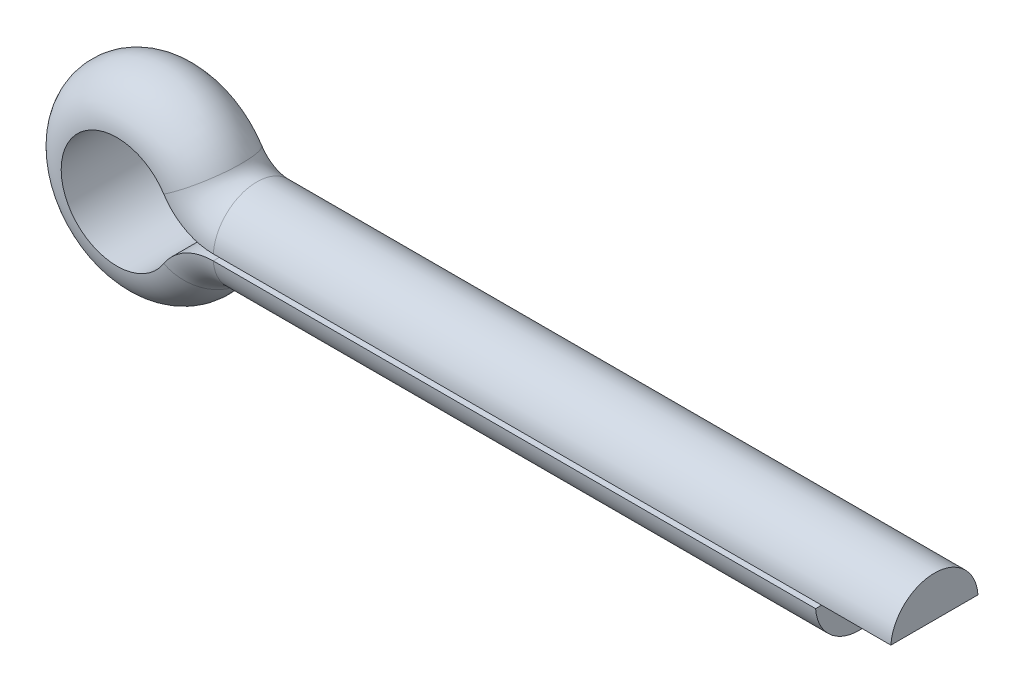
ISO-10303-21;
HEADER;
FILE_DESCRIPTION(('STEP AP214'),'2;1');
FILE_NAME('part.step','',(''),(''),'','','');
FILE_SCHEMA(('AUTOMOTIVE_DESIGN { 1 0 10303 214 1 1 1 1 }'));
ENDSEC;
DATA;
#1=APPLICATION_CONTEXT('core data for automotive mechanical design processes');
#2=APPLICATION_PROTOCOL_DEFINITION('international standard','automotive_design',2000,#1);
#3=PRODUCT_CONTEXT('',#1,'mechanical');
#4=PRODUCT('Part','Part','',(#3));
#5=PRODUCT_RELATED_PRODUCT_CATEGORY('part','',(#4));
#6=PRODUCT_DEFINITION_FORMATION('','',#4);
#7=PRODUCT_DEFINITION_CONTEXT('part definition',#1,'design');
#8=PRODUCT_DEFINITION('design','',#6,#7);
#9=PRODUCT_DEFINITION_SHAPE('','',#8);
#10=(LENGTH_UNIT() NAMED_UNIT(*) SI_UNIT(.MILLI.,.METRE.));
#11=(NAMED_UNIT(*) PLANE_ANGLE_UNIT() SI_UNIT($,.RADIAN.));
#12=(NAMED_UNIT(*) SI_UNIT($,.STERADIAN.) SOLID_ANGLE_UNIT());
#13=UNCERTAINTY_MEASURE_WITH_UNIT(LENGTH_MEASURE(1.E-05),#10,'distance_accuracy_value','');
#14=(GEOMETRIC_REPRESENTATION_CONTEXT(3) GLOBAL_UNCERTAINTY_ASSIGNED_CONTEXT((#13)) GLOBAL_UNIT_ASSIGNED_CONTEXT((#10,
#11,#12)) REPRESENTATION_CONTEXT('',''));
#15=CARTESIAN_POINT('',(0.,0.,0.));
#16=DIRECTION('',(0.,0.,1.));
#17=DIRECTION('',(1.,0.,0.));
#18=AXIS2_PLACEMENT_3D('',#15,#16,#17);
#19=CARTESIAN_POINT('',(0.,0.,0.));
#20=DIRECTION('',(-1.,0.,0.));
#21=DIRECTION('',(0.,0.,1.));
#22=AXIS2_PLACEMENT_3D('',#19,#20,#21);
#23=PLANE('',#22);
#24=CARTESIAN_POINT('',(0.,0.,0.));
#25=DIRECTION('',(1.,0.,0.));
#26=DIRECTION('',(0.,0.,1.));
#27=AXIS2_PLACEMENT_3D('',#24,#25,#26);
#28=CIRCLE('',#27,1.45);
#29=CARTESIAN_POINT('',(0.,0.1,-1.44654761414894));
#30=VERTEX_POINT('',#29);
#31=CARTESIAN_POINT('',(0.,0.1,1.44654761414894));
#32=VERTEX_POINT('',#31);
#33=EDGE_CURVE('E85',#30,#32,#28,.T.);
#34=ORIENTED_EDGE('',*,*,#33,.T.);
#35=DIRECTION('',(0.,0.,-1.));
#36=VECTOR('',#35,1.);
#37=CARTESIAN_POINT('',(0.,0.1,1.44654761414894));
#38=LINE('',#37,#36);
#39=EDGE_CURVE('E94',#32,#30,#38,.T.);
#40=ORIENTED_EDGE('',*,*,#39,.T.);
#41=EDGE_LOOP('',(#34,#40));
#42=FACE_BOUND('',#41,.T.);
#43=ADVANCED_FACE('F34',(#42),#23,.F.);
#44=CARTESIAN_POINT('',(-2.5,0.,0.));
#45=DIRECTION('',(1.,0.,0.));
#46=DIRECTION('',(0.,0.,1.));
#47=AXIS2_PLACEMENT_3D('',#44,#45,#46);
#48=PLANE('',#47);
#49=CARTESIAN_POINT('',(-2.5,0.,0.));
#50=DIRECTION('',(-1.,0.,0.));
#51=DIRECTION('',(0.,0.,1.));
#52=AXIS2_PLACEMENT_3D('',#49,#50,#51);
#53=CIRCLE('',#52,1.45);
#54=CARTESIAN_POINT('',(-2.5,-0.100000000000002,-1.44654761414894));
#55=VERTEX_POINT('',#54);
#56=CARTESIAN_POINT('',(-2.5,-0.100000000000002,1.44654761414894));
#57=VERTEX_POINT('',#56);
#58=EDGE_CURVE('E48',#55,#57,#53,.T.);
#59=ORIENTED_EDGE('',*,*,#58,.F.);
#60=DIRECTION('',(0.,0.,-1.));
#61=VECTOR('',#60,1.);
#62=CARTESIAN_POINT('',(-2.5,-0.100000000000002,1.44654761414894));
#63=LINE('',#62,#61);
#64=EDGE_CURVE('E11',#57,#55,#63,.T.);
#65=ORIENTED_EDGE('',*,*,#64,.F.);
#66=EDGE_LOOP('',(#59,#65));
#67=FACE_BOUND('',#66,.T.);
#68=ADVANCED_FACE('F185',(#67),#48,.T.);
#69=CARTESIAN_POINT('',(0.,0.,0.));
#70=DIRECTION('',(-1.,0.,0.));
#71=DIRECTION('',(0.,-1.,0.));
#72=AXIS2_PLACEMENT_3D('',#69,#70,#71);
#73=CYLINDRICAL_SURFACE('',#72,1.45);
#74=DIRECTION('',(-1.,0.,0.));
#75=VECTOR('',#74,1.);
#76=CARTESIAN_POINT('',(0.,0.1,1.44654761414894));
#77=LINE('',#76,#75);
#78=CARTESIAN_POINT('',(-22.5,0.0999999999999963,1.44654761414894));
#79=VERTEX_POINT('',#78);
#80=EDGE_CURVE('E92',#32,#79,#77,.T.);
#81=ORIENTED_EDGE('',*,*,#80,.F.);
#82=ORIENTED_EDGE('',*,*,#33,.F.);
#83=DIRECTION('',(-1.,0.,0.));
#84=VECTOR('',#83,1.);
#85=CARTESIAN_POINT('',(0.,0.1,-1.44654761414894));
#86=LINE('',#85,#84);
#87=CARTESIAN_POINT('',(-22.5,0.0999999999999963,-1.44654761414894));
#88=VERTEX_POINT('',#87);
#89=EDGE_CURVE('E90',#30,#88,#86,.T.);
#90=ORIENTED_EDGE('',*,*,#89,.T.);
#91=CARTESIAN_POINT('',(-22.5,0.,0.));
#92=DIRECTION('',(1.,0.,0.));
#93=DIRECTION('',(0.,0.,1.));
#94=AXIS2_PLACEMENT_3D('',#91,#92,#93);
#95=CIRCLE('',#94,1.45);
#96=EDGE_CURVE('E103',#88,#79,#95,.T.);
#97=ORIENTED_EDGE('',*,*,#96,.T.);
#98=EDGE_LOOP('',(#81,#82,#90,#97));
#99=FACE_BOUND('',#98,.T.);
#100=ADVANCED_FACE('F87',(#99),#73,.T.);
#101=CARTESIAN_POINT('',(0.,0.1,1.44654761414894));
#102=DIRECTION('',(0.,1.,0.));
#103=DIRECTION('',(-1.,0.,0.));
#104=AXIS2_PLACEMENT_3D('',#101,#102,#103);
#105=PLANE('',#104);
#106=DIRECTION('',(0.,0.,-1.));
#107=VECTOR('',#106,1.);
#108=CARTESIAN_POINT('',(-22.5,0.0999999999999963,1.44654761414894));
#109=LINE('',#108,#107);
#110=EDGE_CURVE('E101',#79,#88,#109,.T.);
#111=ORIENTED_EDGE('',*,*,#110,.T.);
#112=ORIENTED_EDGE('',*,*,#89,.F.);
#113=ORIENTED_EDGE('',*,*,#39,.F.);
#114=ORIENTED_EDGE('',*,*,#80,.T.);
#115=EDGE_LOOP('',(#111,#112,#113,#114));
#116=FACE_BOUND('',#115,.T.);
#117=ADVANCED_FACE('F99',(#116),#105,.F.);
#118=CARTESIAN_POINT('',(-22.5,2.05071428571442,0.));
#119=DIRECTION('',(0.,0.,-1.));
#120=DIRECTION('',(-1.,0.,0.));
#121=AXIS2_PLACEMENT_3D('',#118,#119,#120);
#122=TOROIDAL_SURFACE('',#121,2.05071428571442,1.45);
#123=CARTESIAN_POINT('',(-22.5,2.05071428571442,1.44654761414894));
#124=DIRECTION('',(0.,0.,-1.));
#125=DIRECTION('',(0.,-1.,0.));
#126=AXIS2_PLACEMENT_3D('',#123,#124,#125);
#127=CIRCLE('',#126,1.95071428571442);
#128=CARTESIAN_POINT('',(-24.1423980454803,0.998186431122002,1.44654761414894));
#129=VERTEX_POINT('',#128);
#130=EDGE_CURVE('E111',#79,#129,#127,.T.);
#131=ORIENTED_EDGE('',*,*,#130,.F.);
#132=ORIENTED_EDGE('',*,*,#96,.F.);
#133=CARTESIAN_POINT('',(-22.5,2.05071428571442,-1.44654761414894));
#134=DIRECTION('',(0.,0.,-1.));
#135=DIRECTION('',(0.,-1.,0.));
#136=AXIS2_PLACEMENT_3D('',#133,#134,#135);
#137=CIRCLE('',#136,1.95071428571442);
#138=CARTESIAN_POINT('',(-24.1423980454803,0.998186431122002,-1.44654761414894));
#139=VERTEX_POINT('',#138);
#140=EDGE_CURVE('E112',#88,#139,#137,.T.);
#141=ORIENTED_EDGE('',*,*,#140,.T.);
#142=CARTESIAN_POINT('',(-24.2265927457246,0.94423040781811,0.));
#143=DIRECTION('',(0.539560233038916,-0.841947002443141,0.));
#144=DIRECTION('',(0.,0.,1.));
#145=AXIS2_PLACEMENT_3D('',#142,#143,#144);
#146=CIRCLE('',#145,1.45);
#147=EDGE_CURVE('E108',#139,#129,#146,.T.);
#148=ORIENTED_EDGE('',*,*,#147,.T.);
#149=EDGE_LOOP('',(#131,#132,#141,#148));
#150=FACE_BOUND('',#149,.T.);
#151=ADVANCED_FACE('F165',(#150),#122,.T.);
#152=CARTESIAN_POINT('',(-22.5,2.05071428571442,0.));
#153=DIRECTION('',(0.,0.,-1.));
#154=DIRECTION('',(-1.,0.,0.));
#155=AXIS2_PLACEMENT_3D('',#152,#153,#154);
#156=CYLINDRICAL_SURFACE('',#155,1.95071428571442);
#157=DIRECTION('',(0.,0.,-1.));
#158=VECTOR('',#157,1.);
#159=CARTESIAN_POINT('',(-24.1423980454803,0.998186431122002,1.44654761414894));
#160=LINE('',#159,#158);
#161=EDGE_CURVE('E115',#129,#139,#160,.T.);
#162=ORIENTED_EDGE('',*,*,#161,.T.);
#163=ORIENTED_EDGE('',*,*,#140,.F.);
#164=ORIENTED_EDGE('',*,*,#110,.F.);
#165=ORIENTED_EDGE('',*,*,#130,.T.);
#166=EDGE_LOOP('',(#162,#163,#164,#165));
#167=FACE_BOUND('',#166,.T.);
#168=ADVANCED_FACE('F163',(#167),#156,.T.);
#169=CARTESIAN_POINT('',(-25.7000000000001,0.,0.));
#170=DIRECTION('',(0.,0.,1.));
#171=DIRECTION('',(1.,0.,0.));
#172=AXIS2_PLACEMENT_3D('',#169,#170,#171);
#173=TOROIDAL_SURFACE('',#172,1.75,1.45);
#174=CARTESIAN_POINT('',(-25.7000000000001,0.,1.44654761414894));
#175=DIRECTION('',(0.,0.,1.));
#176=DIRECTION('',(0.84194700244314,0.539560233038918,0.));
#177=AXIS2_PLACEMENT_3D('',#174,#175,#176);
#178=CIRCLE('',#177,1.85);
#179=CARTESIAN_POINT('',(-24.1423980454803,-0.998186431121999,1.44654761414894));
#180=VERTEX_POINT('',#179);
#181=EDGE_CURVE('E121',#129,#180,#178,.T.);
#182=ORIENTED_EDGE('',*,*,#181,.F.);
#183=ORIENTED_EDGE('',*,*,#147,.F.);
#184=CARTESIAN_POINT('',(-25.7000000000001,0.,-1.44654761414894));
#185=DIRECTION('',(0.,0.,1.));
#186=DIRECTION('',(0.84194700244314,0.539560233038918,0.));
#187=AXIS2_PLACEMENT_3D('',#184,#185,#186);
#188=CIRCLE('',#187,1.85);
#189=CARTESIAN_POINT('',(-24.1423980454803,-0.998186431121999,-1.44654761414894));
#190=VERTEX_POINT('',#189);
#191=EDGE_CURVE('E122',#139,#190,#188,.T.);
#192=ORIENTED_EDGE('',*,*,#191,.T.);
#193=CARTESIAN_POINT('',(-24.2265927457246,-0.944230407818108,0.));
#194=DIRECTION('',(-0.539560233038918,-0.84194700244314,0.));
#195=DIRECTION('',(0.,0.,1.));
#196=AXIS2_PLACEMENT_3D('',#193,#194,#195);
#197=CIRCLE('',#196,1.45);
#198=EDGE_CURVE('E118',#190,#180,#197,.T.);
#199=ORIENTED_EDGE('',*,*,#198,.T.);
#200=EDGE_LOOP('',(#182,#183,#192,#199));
#201=FACE_BOUND('',#200,.T.);
#202=ADVANCED_FACE('F158',(#201),#173,.T.);
#203=CARTESIAN_POINT('',(-25.7000000000001,0.,0.));
#204=DIRECTION('',(0.,0.,1.));
#205=DIRECTION('',(1.,0.,0.));
#206=AXIS2_PLACEMENT_3D('',#203,#204,#205);
#207=CYLINDRICAL_SURFACE('',#206,1.85);
#208=DIRECTION('',(0.,0.,-1.));
#209=VECTOR('',#208,1.);
#210=CARTESIAN_POINT('',(-24.1423980454803,-0.998186431121999,1.44654761414894));
#211=LINE('',#210,#209);
#212=EDGE_CURVE('E125',#180,#190,#211,.T.);
#213=ORIENTED_EDGE('',*,*,#212,.T.);
#214=ORIENTED_EDGE('',*,*,#191,.F.);
#215=ORIENTED_EDGE('',*,*,#161,.F.);
#216=ORIENTED_EDGE('',*,*,#181,.T.);
#217=EDGE_LOOP('',(#213,#214,#215,#216));
#218=FACE_BOUND('',#217,.T.);
#219=ADVANCED_FACE('F161',(#218),#207,.F.);
#220=CARTESIAN_POINT('',(-22.5,-2.05071428571442,0.));
#221=DIRECTION('',(0.,0.,-1.));
#222=DIRECTION('',(-1.,0.,0.));
#223=AXIS2_PLACEMENT_3D('',#220,#221,#222);
#224=TOROIDAL_SURFACE('',#223,2.05071428571442,1.45);
#225=CARTESIAN_POINT('',(-22.5,-2.05071428571442,1.44654761414894));
#226=DIRECTION('',(0.,0.,-1.));
#227=DIRECTION('',(-0.841947002443141,0.539560233038917,0.));
#228=AXIS2_PLACEMENT_3D('',#225,#226,#227);
#229=CIRCLE('',#228,1.95071428571442);
#230=CARTESIAN_POINT('',(-22.5,-0.0999999999999992,1.44654761414894));
#231=VERTEX_POINT('',#230);
#232=EDGE_CURVE('E131',#180,#231,#229,.T.);
#233=ORIENTED_EDGE('',*,*,#232,.F.);
#234=ORIENTED_EDGE('',*,*,#198,.F.);
#235=CARTESIAN_POINT('',(-22.5,-2.05071428571442,-1.44654761414894));
#236=DIRECTION('',(0.,0.,-1.));
#237=DIRECTION('',(-0.841947002443141,0.539560233038917,0.));
#238=AXIS2_PLACEMENT_3D('',#235,#236,#237);
#239=CIRCLE('',#238,1.95071428571442);
#240=CARTESIAN_POINT('',(-22.5,-0.0999999999999992,-1.44654761414894));
#241=VERTEX_POINT('',#240);
#242=EDGE_CURVE('E132',#190,#241,#239,.T.);
#243=ORIENTED_EDGE('',*,*,#242,.T.);
#244=CARTESIAN_POINT('',(-22.5,0.,0.));
#245=DIRECTION('',(-1.,0.,0.));
#246=DIRECTION('',(0.,0.,1.));
#247=AXIS2_PLACEMENT_3D('',#244,#245,#246);
#248=CIRCLE('',#247,1.45);
#249=EDGE_CURVE('E128',#241,#231,#248,.T.);
#250=ORIENTED_EDGE('',*,*,#249,.T.);
#251=EDGE_LOOP('',(#233,#234,#243,#250));
#252=FACE_BOUND('',#251,.T.);
#253=ADVANCED_FACE('F155',(#252),#224,.T.);
#254=CARTESIAN_POINT('',(-22.5,-2.05071428571442,0.));
#255=DIRECTION('',(0.,0.,-1.));
#256=DIRECTION('',(-1.,0.,0.));
#257=AXIS2_PLACEMENT_3D('',#254,#255,#256);
#258=CYLINDRICAL_SURFACE('',#257,1.95071428571442);
#259=DIRECTION('',(0.,0.,-1.));
#260=VECTOR('',#259,1.);
#261=CARTESIAN_POINT('',(-22.5,-0.0999999999999983,1.44654761414894));
#262=LINE('',#261,#260);
#263=EDGE_CURVE('E135',#231,#241,#262,.T.);
#264=ORIENTED_EDGE('',*,*,#263,.T.);
#265=ORIENTED_EDGE('',*,*,#242,.F.);
#266=ORIENTED_EDGE('',*,*,#212,.F.);
#267=ORIENTED_EDGE('',*,*,#232,.T.);
#268=EDGE_LOOP('',(#264,#265,#266,#267));
#269=FACE_BOUND('',#268,.T.);
#270=ADVANCED_FACE('F150',(#269),#258,.T.);
#271=CARTESIAN_POINT('',(-22.5,0.,0.));
#272=DIRECTION('',(1.,0.,0.));
#273=DIRECTION('',(0.,1.,0.));
#274=AXIS2_PLACEMENT_3D('',#271,#272,#273);
#275=CYLINDRICAL_SURFACE('',#274,1.45);
#276=DIRECTION('',(1.,0.,0.));
#277=VECTOR('',#276,1.);
#278=CARTESIAN_POINT('',(-22.5,-0.100000000000002,1.44654761414894));
#279=LINE('',#278,#277);
#280=EDGE_CURVE('E41',#231,#57,#279,.T.);
#281=ORIENTED_EDGE('',*,*,#280,.F.);
#282=ORIENTED_EDGE('',*,*,#249,.F.);
#283=DIRECTION('',(1.,0.,0.));
#284=VECTOR('',#283,1.);
#285=CARTESIAN_POINT('',(-22.5,-0.100000000000002,-1.44654761414894));
#286=LINE('',#285,#284);
#287=EDGE_CURVE('E139',#241,#55,#286,.T.);
#288=ORIENTED_EDGE('',*,*,#287,.T.);
#289=ORIENTED_EDGE('',*,*,#58,.T.);
#290=EDGE_LOOP('',(#281,#282,#288,#289));
#291=FACE_BOUND('',#290,.T.);
#292=ADVANCED_FACE('F152',(#291),#275,.T.);
#293=CARTESIAN_POINT('',(-22.5,-0.100000000000002,1.44654761414894));
#294=DIRECTION('',(0.,-1.,0.));
#295=DIRECTION('',(1.,0.,0.));
#296=AXIS2_PLACEMENT_3D('',#293,#294,#295);
#297=PLANE('',#296);
#298=ORIENTED_EDGE('',*,*,#64,.T.);
#299=ORIENTED_EDGE('',*,*,#287,.F.);
#300=ORIENTED_EDGE('',*,*,#263,.F.);
#301=ORIENTED_EDGE('',*,*,#280,.T.);
#302=EDGE_LOOP('',(#298,#299,#300,#301));
#303=FACE_BOUND('',#302,.T.);
#304=ADVANCED_FACE('F176',(#303),#297,.F.);
#305=CLOSED_SHELL('',(#43,#68,#100,#117,#151,#168,#202,#219,#253,#270,#292,#304));
#306=MANIFOLD_SOLID_BREP('B2',#305);
#307=ADVANCED_BREP_SHAPE_REPRESENTATION('',(#18,#306),#14);
#308=SHAPE_DEFINITION_REPRESENTATION(#9,#307);
ENDSEC;
END-ISO-10303-21;
